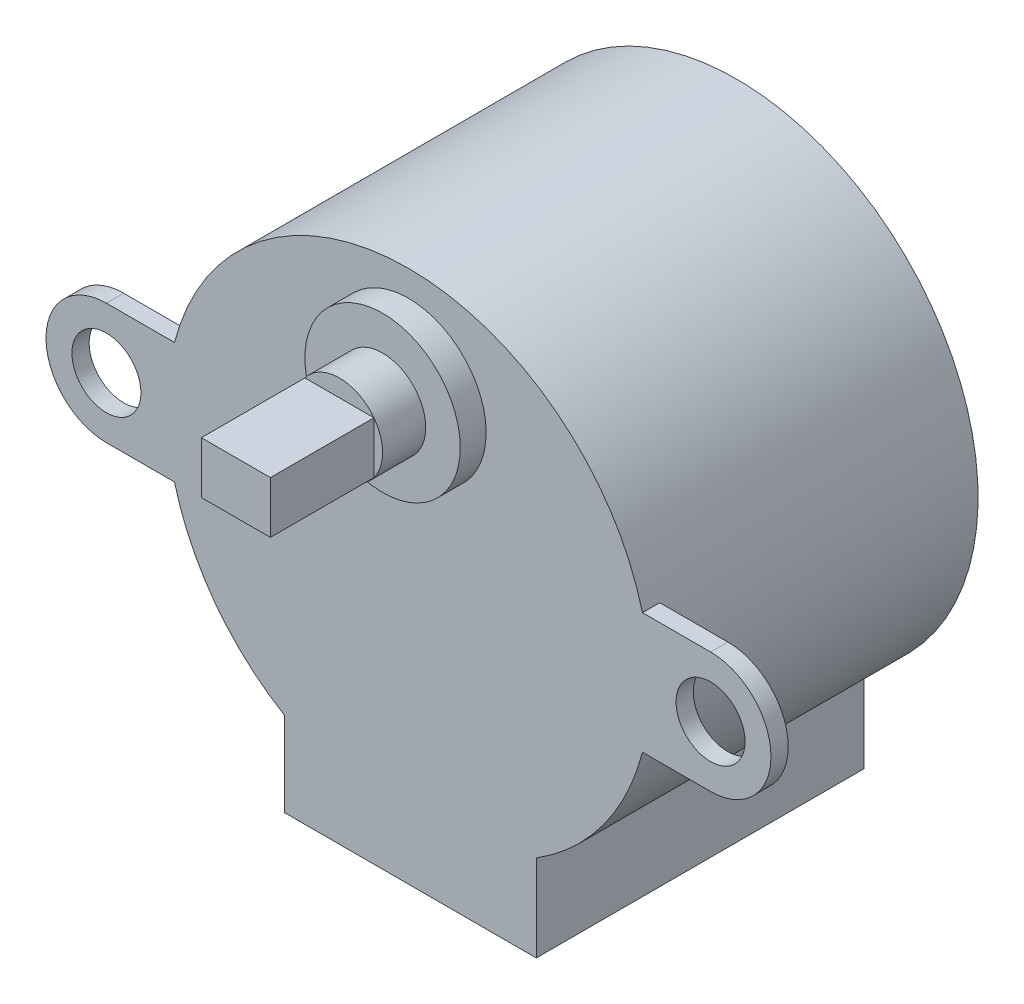
ISO-10303-21;
HEADER;
FILE_DESCRIPTION(('STEP AP214'),'2;1');
FILE_NAME('part.step','',(''),(''),'','','');
FILE_SCHEMA(('AUTOMOTIVE_DESIGN { 1 0 10303 214 1 1 1 1 }'));
ENDSEC;
DATA;
#1=APPLICATION_CONTEXT('core data for automotive mechanical design processes');
#2=APPLICATION_PROTOCOL_DEFINITION('international standard','automotive_design',2000,#1);
#3=PRODUCT_CONTEXT('',#1,'mechanical');
#4=PRODUCT('Part','Part','',(#3));
#5=PRODUCT_RELATED_PRODUCT_CATEGORY('part','',(#4));
#6=PRODUCT_DEFINITION_FORMATION('','',#4);
#7=PRODUCT_DEFINITION_CONTEXT('part definition',#1,'design');
#8=PRODUCT_DEFINITION('design','',#6,#7);
#9=PRODUCT_DEFINITION_SHAPE('','',#8);
#10=(LENGTH_UNIT() NAMED_UNIT(*) SI_UNIT(.MILLI.,.METRE.));
#11=(NAMED_UNIT(*) PLANE_ANGLE_UNIT() SI_UNIT($,.RADIAN.));
#12=(NAMED_UNIT(*) SI_UNIT($,.STERADIAN.) SOLID_ANGLE_UNIT());
#13=UNCERTAINTY_MEASURE_WITH_UNIT(LENGTH_MEASURE(1.E-05),#10,'distance_accuracy_value','');
#14=(GEOMETRIC_REPRESENTATION_CONTEXT(3) GLOBAL_UNCERTAINTY_ASSIGNED_CONTEXT((#13)) GLOBAL_UNIT_ASSIGNED_CONTEXT((#10,
#11,#12)) REPRESENTATION_CONTEXT('',''));
#15=CARTESIAN_POINT('',(0.,0.,0.));
#16=DIRECTION('',(0.,0.,1.));
#17=DIRECTION('',(1.,0.,0.));
#18=AXIS2_PLACEMENT_3D('',#15,#16,#17);
#19=CARTESIAN_POINT('',(0.,3.5,0.));
#20=DIRECTION('',(0.,-1.,0.));
#21=DIRECTION('',(0.,0.,-1.));
#22=AXIS2_PLACEMENT_3D('',#19,#20,#21);
#23=PLANE('',#22);
#24=DIRECTION('',(1.,0.,0.));
#25=VECTOR('',#24,1.);
#26=CARTESIAN_POINT('',(-17.5,3.5,18.));
#27=LINE('',#26,#25);
#28=CARTESIAN_POINT('',(-17.5,3.5,18.));
#29=VERTEX_POINT('',#28);
#30=CARTESIAN_POINT('',(-13.555441711726,3.5,18.));
#31=VERTEX_POINT('',#30);
#32=EDGE_CURVE('E195',#29,#31,#27,.T.);
#33=ORIENTED_EDGE('',*,*,#32,.F.);
#34=DIRECTION('',(0.,0.,-1.));
#35=VECTOR('',#34,1.);
#36=CARTESIAN_POINT('',(-17.5,3.5,19.));
#37=LINE('',#36,#35);
#38=CARTESIAN_POINT('',(-17.5,3.5,19.));
#39=VERTEX_POINT('',#38);
#40=EDGE_CURVE('E321',#39,#29,#37,.T.);
#41=ORIENTED_EDGE('',*,*,#40,.F.);
#42=DIRECTION('',(1.,0.,0.));
#43=VECTOR('',#42,1.);
#44=CARTESIAN_POINT('',(0.,3.5,19.));
#45=LINE('',#44,#43);
#46=CARTESIAN_POINT('',(-13.555441711726,3.5,19.));
#47=VERTEX_POINT('',#46);
#48=EDGE_CURVE('E213',#39,#47,#45,.T.);
#49=ORIENTED_EDGE('',*,*,#48,.T.);
#50=DIRECTION('',(0.,0.,1.));
#51=VECTOR('',#50,1.);
#52=CARTESIAN_POINT('',(-13.555441711726,3.5,0.));
#53=LINE('',#52,#51);
#54=EDGE_CURVE('E212',#31,#47,#53,.T.);
#55=ORIENTED_EDGE('',*,*,#54,.F.);
#56=EDGE_LOOP('',(#33,#41,#49,#55));
#57=FACE_BOUND('',#56,.T.);
#58=ADVANCED_FACE('F74',(#57),#23,.F.);
#59=CARTESIAN_POINT('',(0.,-3.5,0.));
#60=DIRECTION('',(0.,-1.,0.));
#61=DIRECTION('',(0.,0.,-1.));
#62=AXIS2_PLACEMENT_3D('',#59,#60,#61);
#63=PLANE('',#62);
#64=DIRECTION('',(0.,0.,-1.));
#65=VECTOR('',#64,1.);
#66=CARTESIAN_POINT('',(-17.5,-3.5,19.));
#67=LINE('',#66,#65);
#68=CARTESIAN_POINT('',(-17.5,-3.5,19.));
#69=VERTEX_POINT('',#68);
#70=CARTESIAN_POINT('',(-17.5,-3.5,18.));
#71=VERTEX_POINT('',#70);
#72=EDGE_CURVE('E206',#69,#71,#67,.T.);
#73=ORIENTED_EDGE('',*,*,#72,.T.);
#74=DIRECTION('',(-1.,0.,0.));
#75=VECTOR('',#74,1.);
#76=CARTESIAN_POINT('',(-13.555441711726,-3.5,18.));
#77=LINE('',#76,#75);
#78=CARTESIAN_POINT('',(-13.555441711726,-3.5,18.));
#79=VERTEX_POINT('',#78);
#80=EDGE_CURVE('E89',#79,#71,#77,.T.);
#81=ORIENTED_EDGE('',*,*,#80,.F.);
#82=DIRECTION('',(0.,0.,1.));
#83=VECTOR('',#82,1.);
#84=CARTESIAN_POINT('',(-13.555441711726,-3.5,0.));
#85=LINE('',#84,#83);
#86=CARTESIAN_POINT('',(-13.555441711726,-3.5,19.));
#87=VERTEX_POINT('',#86);
#88=EDGE_CURVE('E204',#79,#87,#85,.T.);
#89=ORIENTED_EDGE('',*,*,#88,.T.);
#90=DIRECTION('',(1.,0.,0.));
#91=VECTOR('',#90,1.);
#92=CARTESIAN_POINT('',(0.,-3.5,19.));
#93=LINE('',#92,#91);
#94=EDGE_CURVE('E218',#69,#87,#93,.T.);
#95=ORIENTED_EDGE('',*,*,#94,.F.);
#96=EDGE_LOOP('',(#73,#81,#89,#95));
#97=FACE_BOUND('',#96,.T.);
#98=ADVANCED_FACE('F202',(#97),#63,.T.);
#99=CARTESIAN_POINT('',(-17.5,0.,0.));
#100=DIRECTION('',(0.,0.,1.));
#101=DIRECTION('',(1.,0.,0.));
#102=AXIS2_PLACEMENT_3D('',#99,#100,#101);
#103=CYLINDRICAL_SURFACE('',#102,2.);
#104=CARTESIAN_POINT('',(-17.5,0.,19.));
#105=DIRECTION('',(0.,0.,1.));
#106=DIRECTION('',(1.,0.,0.));
#107=AXIS2_PLACEMENT_3D('',#104,#105,#106);
#108=CIRCLE('',#107,2.);
#109=CARTESIAN_POINT('',(-15.5,0.,19.));
#110=VERTEX_POINT('',#109);
#111=EDGE_CURVE('E326',#110,#110,#108,.T.);
#112=ORIENTED_EDGE('',*,*,#111,.T.);
#113=EDGE_LOOP('',(#112));
#114=FACE_BOUND('',#113,.T.);
#115=CARTESIAN_POINT('',(-17.5,0.,18.));
#116=DIRECTION('',(0.,0.,-1.));
#117=DIRECTION('',(-1.,0.,0.));
#118=AXIS2_PLACEMENT_3D('',#115,#116,#117);
#119=CIRCLE('',#118,2.);
#120=CARTESIAN_POINT('',(-19.5,0.,18.));
#121=VERTEX_POINT('',#120);
#122=EDGE_CURVE('E341',#121,#121,#119,.F.);
#123=ORIENTED_EDGE('',*,*,#122,.F.);
#124=EDGE_LOOP('',(#123));
#125=FACE_BOUND('',#124,.T.);
#126=ADVANCED_FACE('F405',(#114,#125),#103,.F.);
#127=CARTESIAN_POINT('',(-17.5,0.,19.));
#128=DIRECTION('',(0.,0.,-1.));
#129=DIRECTION('',(-1.,0.,0.));
#130=AXIS2_PLACEMENT_3D('',#127,#128,#129);
#131=CYLINDRICAL_SURFACE('',#130,3.5);
#132=ORIENTED_EDGE('',*,*,#40,.T.);
#133=CARTESIAN_POINT('',(-17.5,0.,18.));
#134=DIRECTION('',(0.,0.,-1.));
#135=DIRECTION('',(-1.,0.,0.));
#136=AXIS2_PLACEMENT_3D('',#133,#134,#135);
#137=CIRCLE('',#136,3.5);
#138=EDGE_CURVE('E207',#71,#29,#137,.T.);
#139=ORIENTED_EDGE('',*,*,#138,.F.);
#140=ORIENTED_EDGE('',*,*,#72,.F.);
#141=CARTESIAN_POINT('',(-17.5,0.,19.));
#142=DIRECTION('',(0.,0.,-1.));
#143=DIRECTION('',(1.,0.,0.));
#144=AXIS2_PLACEMENT_3D('',#141,#142,#143);
#145=CIRCLE('',#144,3.5);
#146=EDGE_CURVE('E319',#69,#39,#145,.T.);
#147=ORIENTED_EDGE('',*,*,#146,.T.);
#148=EDGE_LOOP('',(#132,#139,#140,#147));
#149=FACE_BOUND('',#148,.T.);
#150=ADVANCED_FACE('F339',(#149),#131,.T.);
#151=CARTESIAN_POINT('',(0.,-3.5,0.));
#152=DIRECTION('',(0.,-1.,0.));
#153=DIRECTION('',(1.,0.,0.));
#154=AXIS2_PLACEMENT_3D('',#151,#152,#153);
#155=PLANE('',#154);
#156=DIRECTION('',(0.,0.,1.));
#157=VECTOR('',#156,1.);
#158=CARTESIAN_POINT('',(13.555441711726,-3.5,0.));
#159=LINE('',#158,#157);
#160=CARTESIAN_POINT('',(13.555441711726,-3.5,18.));
#161=VERTEX_POINT('',#160);
#162=CARTESIAN_POINT('',(13.555441711726,-3.5,19.));
#163=VERTEX_POINT('',#162);
#164=EDGE_CURVE('E215',#161,#163,#159,.T.);
#165=ORIENTED_EDGE('',*,*,#164,.F.);
#166=DIRECTION('',(-1.,0.,0.));
#167=VECTOR('',#166,1.);
#168=CARTESIAN_POINT('',(17.5,-3.5,18.));
#169=LINE('',#168,#167);
#170=CARTESIAN_POINT('',(17.5,-3.5,18.));
#171=VERTEX_POINT('',#170);
#172=EDGE_CURVE('E349',#171,#161,#169,.T.);
#173=ORIENTED_EDGE('',*,*,#172,.F.);
#174=DIRECTION('',(0.,0.,-1.));
#175=VECTOR('',#174,1.);
#176=CARTESIAN_POINT('',(17.5,-3.5,19.));
#177=LINE('',#176,#175);
#178=CARTESIAN_POINT('',(17.5,-3.5,19.));
#179=VERTEX_POINT('',#178);
#180=EDGE_CURVE('E316',#179,#171,#177,.T.);
#181=ORIENTED_EDGE('',*,*,#180,.F.);
#182=DIRECTION('',(1.,0.,0.));
#183=VECTOR('',#182,1.);
#184=CARTESIAN_POINT('',(0.,-3.5,19.));
#185=LINE('',#184,#183);
#186=EDGE_CURVE('E223',#163,#179,#185,.T.);
#187=ORIENTED_EDGE('',*,*,#186,.F.);
#188=EDGE_LOOP('',(#165,#173,#181,#187));
#189=FACE_BOUND('',#188,.T.);
#190=ADVANCED_FACE('F414',(#189),#155,.T.);
#191=CARTESIAN_POINT('',(0.,3.5,0.));
#192=DIRECTION('',(0.,-1.,0.));
#193=DIRECTION('',(0.,0.,-1.));
#194=AXIS2_PLACEMENT_3D('',#191,#192,#193);
#195=PLANE('',#194);
#196=DIRECTION('',(1.,0.,0.));
#197=VECTOR('',#196,1.);
#198=CARTESIAN_POINT('',(17.5,3.5,18.));
#199=LINE('',#198,#197);
#200=CARTESIAN_POINT('',(13.555441711726,3.5,18.));
#201=VERTEX_POINT('',#200);
#202=CARTESIAN_POINT('',(17.5,3.5,18.));
#203=VERTEX_POINT('',#202);
#204=EDGE_CURVE('E97',#201,#203,#199,.T.);
#205=ORIENTED_EDGE('',*,*,#204,.F.);
#206=DIRECTION('',(0.,0.,1.));
#207=VECTOR('',#206,1.);
#208=CARTESIAN_POINT('',(13.555441711726,3.5,0.));
#209=LINE('',#208,#207);
#210=CARTESIAN_POINT('',(13.555441711726,3.5,19.));
#211=VERTEX_POINT('',#210);
#212=EDGE_CURVE('E221',#201,#211,#209,.T.);
#213=ORIENTED_EDGE('',*,*,#212,.T.);
#214=DIRECTION('',(1.,0.,0.));
#215=VECTOR('',#214,1.);
#216=CARTESIAN_POINT('',(0.,3.5,19.));
#217=LINE('',#216,#215);
#218=CARTESIAN_POINT('',(17.5,3.5,19.));
#219=VERTEX_POINT('',#218);
#220=EDGE_CURVE('E224',#211,#219,#217,.T.);
#221=ORIENTED_EDGE('',*,*,#220,.T.);
#222=DIRECTION('',(0.,0.,-1.));
#223=VECTOR('',#222,1.);
#224=CARTESIAN_POINT('',(17.5,3.5,19.));
#225=LINE('',#224,#223);
#226=EDGE_CURVE('E313',#219,#203,#225,.T.);
#227=ORIENTED_EDGE('',*,*,#226,.T.);
#228=EDGE_LOOP('',(#205,#213,#221,#227));
#229=FACE_BOUND('',#228,.T.);
#230=ADVANCED_FACE('F411',(#229),#195,.F.);
#231=CARTESIAN_POINT('',(17.5,0.,0.));
#232=DIRECTION('',(0.,0.,1.));
#233=DIRECTION('',(1.,0.,0.));
#234=AXIS2_PLACEMENT_3D('',#231,#232,#233);
#235=CYLINDRICAL_SURFACE('',#234,2.);
#236=CARTESIAN_POINT('',(17.5,0.,19.));
#237=DIRECTION('',(0.,0.,1.));
#238=DIRECTION('',(1.,0.,0.));
#239=AXIS2_PLACEMENT_3D('',#236,#237,#238);
#240=CIRCLE('',#239,2.);
#241=CARTESIAN_POINT('',(19.5,0.,19.));
#242=VERTEX_POINT('',#241);
#243=EDGE_CURVE('E325',#242,#242,#240,.T.);
#244=ORIENTED_EDGE('',*,*,#243,.T.);
#245=EDGE_LOOP('',(#244));
#246=FACE_BOUND('',#245,.T.);
#247=CARTESIAN_POINT('',(17.5,0.,18.));
#248=DIRECTION('',(0.,0.,-1.));
#249=DIRECTION('',(-1.,0.,0.));
#250=AXIS2_PLACEMENT_3D('',#247,#248,#249);
#251=CIRCLE('',#250,2.);
#252=CARTESIAN_POINT('',(15.5,0.,18.));
#253=VERTEX_POINT('',#252);
#254=EDGE_CURVE('E355',#253,#253,#251,.F.);
#255=ORIENTED_EDGE('',*,*,#254,.F.);
#256=EDGE_LOOP('',(#255));
#257=FACE_BOUND('',#256,.T.);
#258=ADVANCED_FACE('F408',(#246,#257),#235,.F.);
#259=CARTESIAN_POINT('',(17.5,0.,19.));
#260=DIRECTION('',(0.,0.,-1.));
#261=DIRECTION('',(-1.,0.,0.));
#262=AXIS2_PLACEMENT_3D('',#259,#260,#261);
#263=CYLINDRICAL_SURFACE('',#262,3.5);
#264=ORIENTED_EDGE('',*,*,#180,.T.);
#265=CARTESIAN_POINT('',(17.5,0.,18.));
#266=DIRECTION('',(0.,0.,-1.));
#267=DIRECTION('',(-1.,0.,0.));
#268=AXIS2_PLACEMENT_3D('',#265,#266,#267);
#269=CIRCLE('',#268,3.5);
#270=EDGE_CURVE('E344',#203,#171,#269,.T.);
#271=ORIENTED_EDGE('',*,*,#270,.F.);
#272=ORIENTED_EDGE('',*,*,#226,.F.);
#273=CARTESIAN_POINT('',(17.5,0.,19.));
#274=DIRECTION('',(0.,0.,-1.));
#275=DIRECTION('',(1.,0.,0.));
#276=AXIS2_PLACEMENT_3D('',#273,#274,#275);
#277=CIRCLE('',#276,3.5);
#278=EDGE_CURVE('E311',#219,#179,#277,.T.);
#279=ORIENTED_EDGE('',*,*,#278,.T.);
#280=EDGE_LOOP('',(#264,#271,#272,#279));
#281=FACE_BOUND('',#280,.T.);
#282=ADVANCED_FACE('F462',(#281),#263,.T.);
#283=CARTESIAN_POINT('',(0.,8.,23.));
#284=DIRECTION('',(0.,0.,1.));
#285=DIRECTION('',(1.,0.,0.));
#286=AXIS2_PLACEMENT_3D('',#283,#284,#285);
#287=PLANE('',#286);
#288=CARTESIAN_POINT('',(0.,8.,23.));
#289=DIRECTION('',(0.,0.,1.));
#290=DIRECTION('',(1.,0.,0.));
#291=AXIS2_PLACEMENT_3D('',#288,#289,#290);
#292=CIRCLE('',#291,2.5);
#293=CARTESIAN_POINT('',(-2.,9.5,23.));
#294=VERTEX_POINT('',#293);
#295=CARTESIAN_POINT('',(-2.,6.5,23.));
#296=VERTEX_POINT('',#295);
#297=EDGE_CURVE('E291',#294,#296,#292,.T.);
#298=ORIENTED_EDGE('',*,*,#297,.T.);
#299=DIRECTION('',(0.,1.,0.));
#300=VECTOR('',#299,1.);
#301=CARTESIAN_POINT('',(-2.,8.,23.));
#302=LINE('',#301,#300);
#303=EDGE_CURVE('E12',#296,#294,#302,.T.);
#304=ORIENTED_EDGE('',*,*,#303,.T.);
#305=EDGE_LOOP('',(#298,#304));
#306=FACE_BOUND('',#305,.T.);
#307=ADVANCED_FACE('F297',(#306),#287,.T.);
#308=CARTESIAN_POINT('',(2.,6.5,23.));
#309=VERTEX_POINT('',#308);
#310=EDGE_CURVE('E279',#296,#309,#292,.T.);
#311=ORIENTED_EDGE('',*,*,#310,.T.);
#312=DIRECTION('',(-1.,0.,0.));
#313=VECTOR('',#312,1.);
#314=CARTESIAN_POINT('',(0.,6.5,23.));
#315=LINE('',#314,#313);
#316=EDGE_CURVE('E82',#309,#296,#315,.T.);
#317=ORIENTED_EDGE('',*,*,#316,.T.);
#318=EDGE_LOOP('',(#311,#317));
#319=FACE_BOUND('',#318,.T.);
#320=ADVANCED_FACE('F278',(#319),#287,.T.);
#321=CARTESIAN_POINT('',(2.,9.5,23.));
#322=VERTEX_POINT('',#321);
#323=EDGE_CURVE('E294',#309,#322,#292,.T.);
#324=ORIENTED_EDGE('',*,*,#323,.T.);
#325=DIRECTION('',(0.,-1.,0.));
#326=VECTOR('',#325,1.);
#327=CARTESIAN_POINT('',(2.,8.,23.));
#328=LINE('',#327,#326);
#329=EDGE_CURVE('E272',#322,#309,#328,.T.);
#330=ORIENTED_EDGE('',*,*,#329,.T.);
#331=EDGE_LOOP('',(#324,#330));
#332=FACE_BOUND('',#331,.T.);
#333=ADVANCED_FACE('F377',(#332),#287,.T.);
#334=EDGE_CURVE('E298',#322,#294,#292,.T.);
#335=ORIENTED_EDGE('',*,*,#334,.T.);
#336=DIRECTION('',(1.,0.,0.));
#337=VECTOR('',#336,1.);
#338=CARTESIAN_POINT('',(0.,9.5,23.));
#339=LINE('',#338,#337);
#340=EDGE_CURVE('E269',#294,#322,#339,.T.);
#341=ORIENTED_EDGE('',*,*,#340,.T.);
#342=EDGE_LOOP('',(#335,#341));
#343=FACE_BOUND('',#342,.T.);
#344=ADVANCED_FACE('F379',(#343),#287,.T.);
#345=CARTESIAN_POINT('',(0.,0.,19.));
#346=DIRECTION('',(0.,0.,1.));
#347=DIRECTION('',(1.,0.,0.));
#348=AXIS2_PLACEMENT_3D('',#345,#346,#347);
#349=PLANE('',#348);
#350=CARTESIAN_POINT('',(0.,8.,19.));
#351=DIRECTION('',(0.,0.,1.));
#352=DIRECTION('',(1.,0.,0.));
#353=AXIS2_PLACEMENT_3D('',#350,#351,#352);
#354=CIRCLE('',#353,4.5);
#355=CARTESIAN_POINT('',(4.5,8.,19.));
#356=VERTEX_POINT('',#355);
#357=EDGE_CURVE('E308',#356,#356,#354,.F.);
#358=ORIENTED_EDGE('',*,*,#357,.T.);
#359=EDGE_LOOP('',(#358));
#360=FACE_BOUND('',#359,.T.);
#361=ORIENTED_EDGE('',*,*,#111,.F.);
#362=EDGE_LOOP('',(#361));
#363=FACE_BOUND('',#362,.T.);
#364=ORIENTED_EDGE('',*,*,#243,.F.);
#365=EDGE_LOOP('',(#364));
#366=FACE_BOUND('',#365,.T.);
#367=ORIENTED_EDGE('',*,*,#186,.T.);
#368=ORIENTED_EDGE('',*,*,#278,.F.);
#369=ORIENTED_EDGE('',*,*,#220,.F.);
#370=CARTESIAN_POINT('',(0.,0.,19.));
#371=DIRECTION('',(0.,0.,1.));
#372=DIRECTION('',(1.,0.,0.));
#373=AXIS2_PLACEMENT_3D('',#370,#371,#372);
#374=CIRCLE('',#373,14.);
#375=EDGE_CURVE('E267',#211,#47,#374,.T.);
#376=ORIENTED_EDGE('',*,*,#375,.T.);
#377=ORIENTED_EDGE('',*,*,#48,.F.);
#378=ORIENTED_EDGE('',*,*,#146,.F.);
#379=ORIENTED_EDGE('',*,*,#94,.T.);
#380=CARTESIAN_POINT('',(-7.19571826832794,-12.0092313910113,19.));
#381=VERTEX_POINT('',#380);
#382=EDGE_CURVE('E211',#87,#381,#374,.T.);
#383=ORIENTED_EDGE('',*,*,#382,.T.);
#384=DIRECTION('',(0.,-1.,0.));
#385=VECTOR('',#384,1.);
#386=CARTESIAN_POINT('',(-7.19571826832794,-11.9016066299532,19.));
#387=LINE('',#386,#385);
#388=CARTESIAN_POINT('',(-7.19571826832794,-16.9016066299532,19.));
#389=VERTEX_POINT('',#388);
#390=EDGE_CURVE('E235',#381,#389,#387,.T.);
#391=ORIENTED_EDGE('',*,*,#390,.T.);
#392=DIRECTION('',(1.,0.,0.));
#393=VECTOR('',#392,1.);
#394=CARTESIAN_POINT('',(-7.19571826832794,-16.9016066299532,19.));
#395=LINE('',#394,#393);
#396=CARTESIAN_POINT('',(7.40428173167206,-16.9016066299532,19.));
#397=VERTEX_POINT('',#396);
#398=EDGE_CURVE('E228',#389,#397,#395,.T.);
#399=ORIENTED_EDGE('',*,*,#398,.T.);
#400=DIRECTION('',(0.,-1.,0.));
#401=VECTOR('',#400,1.);
#402=CARTESIAN_POINT('',(7.40428173167206,-11.9016066299532,19.));
#403=LINE('',#402,#401);
#404=CARTESIAN_POINT('',(7.40428173167206,-11.9016066299532,19.));
#405=VERTEX_POINT('',#404);
#406=EDGE_CURVE('E244',#405,#397,#403,.T.);
#407=ORIENTED_EDGE('',*,*,#406,.F.);
#408=DIRECTION('',(1.,0.,0.));
#409=VECTOR('',#408,1.);
#410=CARTESIAN_POINT('',(-7.19571826832794,-11.9016066299532,19.));
#411=LINE('',#410,#409);
#412=CARTESIAN_POINT('',(7.37236458850575,-11.9016066299532,19.));
#413=VERTEX_POINT('',#412);
#414=EDGE_CURVE('E247',#413,#405,#411,.T.);
#415=ORIENTED_EDGE('',*,*,#414,.F.);
#416=EDGE_CURVE('E263',#413,#163,#374,.T.);
#417=ORIENTED_EDGE('',*,*,#416,.T.);
#418=EDGE_LOOP('',(#367,#368,#369,#376,#377,#378,#379,#383,#391,#399,#407,#415,#417));
#419=FACE_BOUND('',#418,.T.);
#420=ADVANCED_FACE('F333',(#360,#363,#366,#419),#349,.T.);
#421=CARTESIAN_POINT('',(0.,0.,0.));
#422=DIRECTION('',(0.,0.,1.));
#423=DIRECTION('',(1.,0.,0.));
#424=AXIS2_PLACEMENT_3D('',#421,#422,#423);
#425=PLANE('',#424);
#426=DIRECTION('',(0.,-1.,0.));
#427=VECTOR('',#426,1.);
#428=CARTESIAN_POINT('',(-7.19571826832794,-11.9016066299532,0.));
#429=LINE('',#428,#427);
#430=CARTESIAN_POINT('',(-7.19571826832794,-12.0092313910113,0.));
#431=VERTEX_POINT('',#430);
#432=CARTESIAN_POINT('',(-7.19571826832794,-16.9016066299532,0.));
#433=VERTEX_POINT('',#432);
#434=EDGE_CURVE('E239',#431,#433,#429,.T.);
#435=ORIENTED_EDGE('',*,*,#434,.F.);
#436=CARTESIAN_POINT('',(0.,0.,0.));
#437=DIRECTION('',(0.,0.,1.));
#438=DIRECTION('',(1.,0.,0.));
#439=AXIS2_PLACEMENT_3D('',#436,#437,#438);
#440=CIRCLE('',#439,14.);
#441=CARTESIAN_POINT('',(7.37236458850575,-11.9016066299532,0.));
#442=VERTEX_POINT('',#441);
#443=EDGE_CURVE('E262',#442,#431,#440,.T.);
#444=ORIENTED_EDGE('',*,*,#443,.F.);
#445=DIRECTION('',(1.,0.,0.));
#446=VECTOR('',#445,1.);
#447=CARTESIAN_POINT('',(-7.19571826832794,-11.9016066299532,0.));
#448=LINE('',#447,#446);
#449=CARTESIAN_POINT('',(7.40428173167206,-11.9016066299532,0.));
#450=VERTEX_POINT('',#449);
#451=EDGE_CURVE('E237',#442,#450,#448,.T.);
#452=ORIENTED_EDGE('',*,*,#451,.T.);
#453=DIRECTION('',(0.,-1.,0.));
#454=VECTOR('',#453,1.);
#455=CARTESIAN_POINT('',(7.40428173167206,-11.9016066299532,0.));
#456=LINE('',#455,#454);
#457=CARTESIAN_POINT('',(7.40428173167206,-16.9016066299532,0.));
#458=VERTEX_POINT('',#457);
#459=EDGE_CURVE('E234',#450,#458,#456,.T.);
#460=ORIENTED_EDGE('',*,*,#459,.T.);
#461=DIRECTION('',(1.,0.,0.));
#462=VECTOR('',#461,1.);
#463=CARTESIAN_POINT('',(-7.19571826832794,-16.9016066299532,0.));
#464=LINE('',#463,#462);
#465=EDGE_CURVE('E231',#433,#458,#464,.T.);
#466=ORIENTED_EDGE('',*,*,#465,.F.);
#467=EDGE_LOOP('',(#435,#444,#452,#460,#466));
#468=FACE_BOUND('',#467,.T.);
#469=ADVANCED_FACE('F437',(#468),#425,.F.);
#470=CARTESIAN_POINT('',(0.,0.,19.));
#471=DIRECTION('',(0.,0.,-1.));
#472=DIRECTION('',(-1.,0.,0.));
#473=AXIS2_PLACEMENT_3D('',#470,#471,#472);
#474=CYLINDRICAL_SURFACE('',#473,14.);
#475=ORIENTED_EDGE('',*,*,#443,.T.);
#476=DIRECTION('',(0.,0.,-1.));
#477=VECTOR('',#476,1.);
#478=CARTESIAN_POINT('',(-7.19571826832794,-12.0092313910113,19.));
#479=LINE('',#478,#477);
#480=EDGE_CURVE('E260',#431,#381,#479,.F.);
#481=ORIENTED_EDGE('',*,*,#480,.T.);
#482=ORIENTED_EDGE('',*,*,#382,.F.);
#483=ORIENTED_EDGE('',*,*,#88,.F.);
#484=CARTESIAN_POINT('',(0.,0.,18.));
#485=DIRECTION('',(0.,0.,1.));
#486=DIRECTION('',(-1.,0.,0.));
#487=AXIS2_PLACEMENT_3D('',#484,#485,#486);
#488=CIRCLE('',#487,14.);
#489=EDGE_CURVE('E191',#31,#79,#488,.T.);
#490=ORIENTED_EDGE('',*,*,#489,.F.);
#491=ORIENTED_EDGE('',*,*,#54,.T.);
#492=ORIENTED_EDGE('',*,*,#375,.F.);
#493=ORIENTED_EDGE('',*,*,#212,.F.);
#494=CARTESIAN_POINT('',(0.,0.,18.));
#495=DIRECTION('',(0.,0.,1.));
#496=DIRECTION('',(-1.,0.,0.));
#497=AXIS2_PLACEMENT_3D('',#494,#495,#496);
#498=CIRCLE('',#497,14.);
#499=EDGE_CURVE('E352',#161,#201,#498,.T.);
#500=ORIENTED_EDGE('',*,*,#499,.F.);
#501=ORIENTED_EDGE('',*,*,#164,.T.);
#502=ORIENTED_EDGE('',*,*,#416,.F.);
#503=DIRECTION('',(0.,0.,-1.));
#504=VECTOR('',#503,1.);
#505=CARTESIAN_POINT('',(7.37236458850575,-11.9016066299532,19.));
#506=LINE('',#505,#504);
#507=EDGE_CURVE('E253',#442,#413,#506,.F.);
#508=ORIENTED_EDGE('',*,*,#507,.F.);
#509=EDGE_LOOP('',(#475,#481,#482,#483,#490,#491,#492,#493,#500,#501,#502,#508));
#510=FACE_BOUND('',#509,.T.);
#511=ADVANCED_FACE('F76',(#510),#474,.T.);
#512=CARTESIAN_POINT('',(-7.19571826832794,-11.9016066299532,0.));
#513=DIRECTION('',(-1.,0.,0.));
#514=DIRECTION('',(0.,0.,1.));
#515=AXIS2_PLACEMENT_3D('',#512,#513,#514);
#516=PLANE('',#515);
#517=ORIENTED_EDGE('',*,*,#480,.F.);
#518=ORIENTED_EDGE('',*,*,#434,.T.);
#519=DIRECTION('',(0.,0.,1.));
#520=VECTOR('',#519,1.);
#521=CARTESIAN_POINT('',(-7.19571826832794,-16.9016066299532,0.));
#522=LINE('',#521,#520);
#523=EDGE_CURVE('E250',#433,#389,#522,.T.);
#524=ORIENTED_EDGE('',*,*,#523,.T.);
#525=ORIENTED_EDGE('',*,*,#390,.F.);
#526=EDGE_LOOP('',(#517,#518,#524,#525));
#527=FACE_BOUND('',#526,.T.);
#528=ADVANCED_FACE('F419',(#527),#516,.T.);
#529=CARTESIAN_POINT('',(-7.19571826832794,-11.9016066299532,0.));
#530=DIRECTION('',(0.,-1.,0.));
#531=DIRECTION('',(1.,0.,0.));
#532=AXIS2_PLACEMENT_3D('',#529,#530,#531);
#533=PLANE('',#532);
#534=ORIENTED_EDGE('',*,*,#451,.F.);
#535=ORIENTED_EDGE('',*,*,#507,.T.);
#536=ORIENTED_EDGE('',*,*,#414,.T.);
#537=DIRECTION('',(0.,0.,1.));
#538=VECTOR('',#537,1.);
#539=CARTESIAN_POINT('',(7.40428173167206,-11.9016066299532,0.));
#540=LINE('',#539,#538);
#541=EDGE_CURVE('E254',#450,#405,#540,.T.);
#542=ORIENTED_EDGE('',*,*,#541,.F.);
#543=EDGE_LOOP('',(#534,#535,#536,#542));
#544=FACE_BOUND('',#543,.T.);
#545=ADVANCED_FACE('F422',(#544),#533,.F.);
#546=CARTESIAN_POINT('',(-7.19571826832794,-16.9016066299532,0.));
#547=DIRECTION('',(0.,-1.,0.));
#548=DIRECTION('',(0.,0.,-1.));
#549=AXIS2_PLACEMENT_3D('',#546,#547,#548);
#550=PLANE('',#549);
#551=ORIENTED_EDGE('',*,*,#398,.F.);
#552=ORIENTED_EDGE('',*,*,#523,.F.);
#553=ORIENTED_EDGE('',*,*,#465,.T.);
#554=DIRECTION('',(0.,0.,1.));
#555=VECTOR('',#554,1.);
#556=CARTESIAN_POINT('',(7.40428173167206,-16.9016066299532,0.));
#557=LINE('',#556,#555);
#558=EDGE_CURVE('E241',#458,#397,#557,.T.);
#559=ORIENTED_EDGE('',*,*,#558,.T.);
#560=EDGE_LOOP('',(#551,#552,#553,#559));
#561=FACE_BOUND('',#560,.T.);
#562=ADVANCED_FACE('F426',(#561),#550,.T.);
#563=CARTESIAN_POINT('',(7.40428173167206,-11.9016066299532,0.));
#564=DIRECTION('',(-1.,0.,0.));
#565=DIRECTION('',(0.,0.,1.));
#566=AXIS2_PLACEMENT_3D('',#563,#564,#565);
#567=PLANE('',#566);
#568=ORIENTED_EDGE('',*,*,#406,.T.);
#569=ORIENTED_EDGE('',*,*,#558,.F.);
#570=ORIENTED_EDGE('',*,*,#459,.F.);
#571=ORIENTED_EDGE('',*,*,#541,.T.);
#572=EDGE_LOOP('',(#568,#569,#570,#571));
#573=FACE_BOUND('',#572,.T.);
#574=ADVANCED_FACE('F428',(#573),#567,.F.);
#575=CARTESIAN_POINT('',(0.,8.,20.5));
#576=DIRECTION('',(0.,0.,-1.));
#577=DIRECTION('',(-1.,0.,0.));
#578=AXIS2_PLACEMENT_3D('',#575,#576,#577);
#579=CYLINDRICAL_SURFACE('',#578,4.5);
#580=ORIENTED_EDGE('',*,*,#357,.F.);
#581=EDGE_LOOP('',(#580));
#582=FACE_BOUND('',#581,.T.);
#583=CARTESIAN_POINT('',(0.,8.,20.5));
#584=DIRECTION('',(0.,0.,1.));
#585=DIRECTION('',(1.,0.,0.));
#586=AXIS2_PLACEMENT_3D('',#583,#584,#585);
#587=CIRCLE('',#586,4.5);
#588=CARTESIAN_POINT('',(4.5,8.,20.5));
#589=VERTEX_POINT('',#588);
#590=EDGE_CURVE('E299',#589,#589,#587,.T.);
#591=ORIENTED_EDGE('',*,*,#590,.F.);
#592=EDGE_LOOP('',(#591));
#593=FACE_BOUND('',#592,.T.);
#594=ADVANCED_FACE('F431',(#582,#593),#579,.T.);
#595=CARTESIAN_POINT('',(0.,8.,20.5));
#596=DIRECTION('',(0.,0.,1.));
#597=DIRECTION('',(1.,0.,0.));
#598=AXIS2_PLACEMENT_3D('',#595,#596,#597);
#599=PLANE('',#598);
#600=CARTESIAN_POINT('',(0.,8.,20.5));
#601=DIRECTION('',(0.,0.,1.));
#602=DIRECTION('',(1.,0.,0.));
#603=AXIS2_PLACEMENT_3D('',#600,#601,#602);
#604=CIRCLE('',#603,2.5);
#605=CARTESIAN_POINT('',(2.5,8.,20.5));
#606=VERTEX_POINT('',#605);
#607=EDGE_CURVE('E266',#606,#606,#604,.T.);
#608=ORIENTED_EDGE('',*,*,#607,.F.);
#609=EDGE_LOOP('',(#608));
#610=FACE_BOUND('',#609,.T.);
#611=ORIENTED_EDGE('',*,*,#590,.T.);
#612=EDGE_LOOP('',(#611));
#613=FACE_BOUND('',#612,.T.);
#614=ADVANCED_FACE('F574',(#610,#613),#599,.T.);
#615=CARTESIAN_POINT('',(0.,8.,23.));
#616=DIRECTION('',(0.,0.,-1.));
#617=DIRECTION('',(-1.,0.,0.));
#618=AXIS2_PLACEMENT_3D('',#615,#616,#617);
#619=CYLINDRICAL_SURFACE('',#618,2.5);
#620=ORIENTED_EDGE('',*,*,#310,.F.);
#621=ORIENTED_EDGE('',*,*,#297,.F.);
#622=ORIENTED_EDGE('',*,*,#334,.F.);
#623=ORIENTED_EDGE('',*,*,#323,.F.);
#624=EDGE_LOOP('',(#620,#621,#622,#623));
#625=FACE_BOUND('',#624,.T.);
#626=ORIENTED_EDGE('',*,*,#607,.T.);
#627=EDGE_LOOP('',(#626));
#628=FACE_BOUND('',#627,.T.);
#629=ADVANCED_FACE('F288',(#625,#628),#619,.T.);
#630=CARTESIAN_POINT('',(-2.,9.5,29.));
#631=DIRECTION('',(1.,0.,0.));
#632=DIRECTION('',(0.,1.,0.));
#633=AXIS2_PLACEMENT_3D('',#630,#631,#632);
#634=PLANE('',#633);
#635=ORIENTED_EDGE('',*,*,#303,.F.);
#636=DIRECTION('',(0.,0.,-1.));
#637=VECTOR('',#636,1.);
#638=CARTESIAN_POINT('',(-2.,6.5,29.));
#639=LINE('',#638,#637);
#640=CARTESIAN_POINT('',(-2.,6.5,29.));
#641=VERTEX_POINT('',#640);
#642=EDGE_CURVE('E302',#641,#296,#639,.T.);
#643=ORIENTED_EDGE('',*,*,#642,.F.);
#644=DIRECTION('',(0.,-1.,0.));
#645=VECTOR('',#644,1.);
#646=CARTESIAN_POINT('',(-2.,9.5,29.));
#647=LINE('',#646,#645);
#648=CARTESIAN_POINT('',(-2.,9.5,29.));
#649=VERTEX_POINT('',#648);
#650=EDGE_CURVE('E358',#649,#641,#647,.T.);
#651=ORIENTED_EDGE('',*,*,#650,.F.);
#652=DIRECTION('',(0.,0.,-1.));
#653=VECTOR('',#652,1.);
#654=CARTESIAN_POINT('',(-2.,9.5,29.));
#655=LINE('',#654,#653);
#656=EDGE_CURVE('E367',#649,#294,#655,.T.);
#657=ORIENTED_EDGE('',*,*,#656,.T.);
#658=EDGE_LOOP('',(#635,#643,#651,#657));
#659=FACE_BOUND('',#658,.T.);
#660=ADVANCED_FACE('F387',(#659),#634,.F.);
#661=CARTESIAN_POINT('',(-2.,6.5,29.));
#662=DIRECTION('',(0.,1.,0.));
#663=DIRECTION('',(0.,0.,1.));
#664=AXIS2_PLACEMENT_3D('',#661,#662,#663);
#665=PLANE('',#664);
#666=ORIENTED_EDGE('',*,*,#316,.F.);
#667=DIRECTION('',(0.,0.,-1.));
#668=VECTOR('',#667,1.);
#669=CARTESIAN_POINT('',(2.,6.5,29.));
#670=LINE('',#669,#668);
#671=CARTESIAN_POINT('',(2.,6.5,29.));
#672=VERTEX_POINT('',#671);
#673=EDGE_CURVE('E371',#672,#309,#670,.T.);
#674=ORIENTED_EDGE('',*,*,#673,.F.);
#675=DIRECTION('',(1.,0.,0.));
#676=VECTOR('',#675,1.);
#677=CARTESIAN_POINT('',(-2.,6.5,29.));
#678=LINE('',#677,#676);
#679=EDGE_CURVE('E361',#641,#672,#678,.T.);
#680=ORIENTED_EDGE('',*,*,#679,.F.);
#681=ORIENTED_EDGE('',*,*,#642,.T.);
#682=EDGE_LOOP('',(#666,#674,#680,#681));
#683=FACE_BOUND('',#682,.T.);
#684=ADVANCED_FACE('F392',(#683),#665,.F.);
#685=CARTESIAN_POINT('',(2.,9.5,29.));
#686=DIRECTION('',(-1.,0.,0.));
#687=DIRECTION('',(0.,0.,1.));
#688=AXIS2_PLACEMENT_3D('',#685,#686,#687);
#689=PLANE('',#688);
#690=ORIENTED_EDGE('',*,*,#329,.F.);
#691=DIRECTION('',(0.,0.,-1.));
#692=VECTOR('',#691,1.);
#693=CARTESIAN_POINT('',(2.,9.5,29.));
#694=LINE('',#693,#692);
#695=CARTESIAN_POINT('',(2.,9.5,29.));
#696=VERTEX_POINT('',#695);
#697=EDGE_CURVE('E370',#696,#322,#694,.T.);
#698=ORIENTED_EDGE('',*,*,#697,.F.);
#699=DIRECTION('',(0.,1.,0.));
#700=VECTOR('',#699,1.);
#701=CARTESIAN_POINT('',(2.,9.5,29.));
#702=LINE('',#701,#700);
#703=EDGE_CURVE('E363',#672,#696,#702,.T.);
#704=ORIENTED_EDGE('',*,*,#703,.F.);
#705=ORIENTED_EDGE('',*,*,#673,.T.);
#706=EDGE_LOOP('',(#690,#698,#704,#705));
#707=FACE_BOUND('',#706,.T.);
#708=ADVANCED_FACE('F390',(#707),#689,.F.);
#709=CARTESIAN_POINT('',(-2.,9.5,29.));
#710=DIRECTION('',(0.,-1.,0.));
#711=DIRECTION('',(0.,0.,-1.));
#712=AXIS2_PLACEMENT_3D('',#709,#710,#711);
#713=PLANE('',#712);
#714=ORIENTED_EDGE('',*,*,#340,.F.);
#715=ORIENTED_EDGE('',*,*,#656,.F.);
#716=DIRECTION('',(-1.,0.,0.));
#717=VECTOR('',#716,1.);
#718=CARTESIAN_POINT('',(-2.,9.5,29.));
#719=LINE('',#718,#717);
#720=EDGE_CURVE('E365',#696,#649,#719,.T.);
#721=ORIENTED_EDGE('',*,*,#720,.F.);
#722=ORIENTED_EDGE('',*,*,#697,.T.);
#723=EDGE_LOOP('',(#714,#715,#721,#722));
#724=FACE_BOUND('',#723,.T.);
#725=ADVANCED_FACE('F382',(#724),#713,.F.);
#726=CARTESIAN_POINT('',(0.,0.,29.));
#727=DIRECTION('',(0.,0.,1.));
#728=DIRECTION('',(1.,0.,0.));
#729=AXIS2_PLACEMENT_3D('',#726,#727,#728);
#730=PLANE('',#729);
#731=ORIENTED_EDGE('',*,*,#650,.T.);
#732=ORIENTED_EDGE('',*,*,#679,.T.);
#733=ORIENTED_EDGE('',*,*,#703,.T.);
#734=ORIENTED_EDGE('',*,*,#720,.T.);
#735=EDGE_LOOP('',(#731,#732,#733,#734));
#736=FACE_BOUND('',#735,.T.);
#737=ADVANCED_FACE('F389',(#736),#730,.T.);
#738=CARTESIAN_POINT('',(17.5,0.,18.));
#739=DIRECTION('',(0.,0.,-1.));
#740=DIRECTION('',(-1.,0.,0.));
#741=AXIS2_PLACEMENT_3D('',#738,#739,#740);
#742=PLANE('',#741);
#743=ORIENTED_EDGE('',*,*,#270,.T.);
#744=ORIENTED_EDGE('',*,*,#172,.T.);
#745=ORIENTED_EDGE('',*,*,#499,.T.);
#746=ORIENTED_EDGE('',*,*,#204,.T.);
#747=EDGE_LOOP('',(#743,#744,#745,#746));
#748=FACE_BOUND('',#747,.T.);
#749=ORIENTED_EDGE('',*,*,#254,.T.);
#750=EDGE_LOOP('',(#749));
#751=FACE_BOUND('',#750,.T.);
#752=ADVANCED_FACE('F466',(#748,#751),#742,.T.);
#753=CARTESIAN_POINT('',(0.,0.,18.));
#754=DIRECTION('',(0.,0.,-1.));
#755=DIRECTION('',(-1.,0.,0.));
#756=AXIS2_PLACEMENT_3D('',#753,#754,#755);
#757=PLANE('',#756);
#758=ORIENTED_EDGE('',*,*,#489,.T.);
#759=ORIENTED_EDGE('',*,*,#80,.T.);
#760=ORIENTED_EDGE('',*,*,#138,.T.);
#761=ORIENTED_EDGE('',*,*,#32,.T.);
#762=EDGE_LOOP('',(#758,#759,#760,#761));
#763=FACE_BOUND('',#762,.T.);
#764=ORIENTED_EDGE('',*,*,#122,.T.);
#765=EDGE_LOOP('',(#764));
#766=FACE_BOUND('',#765,.T.);
#767=ADVANCED_FACE('F192',(#763,#766),#757,.T.);
#768=CLOSED_SHELL('',(#58,#98,#126,#150,#190,#230,#258,#282,#307,#320,#333,#344,#420,#469,#511,
#528,#545,#562,#574,#594,#614,#629,#660,#684,#708,#725,#737,#752,#767));
#769=MANIFOLD_SOLID_BREP('B2',#768);
#770=ADVANCED_BREP_SHAPE_REPRESENTATION('',(#18,#769),#14);
#771=SHAPE_DEFINITION_REPRESENTATION(#9,#770);
ENDSEC;
END-ISO-10303-21;
